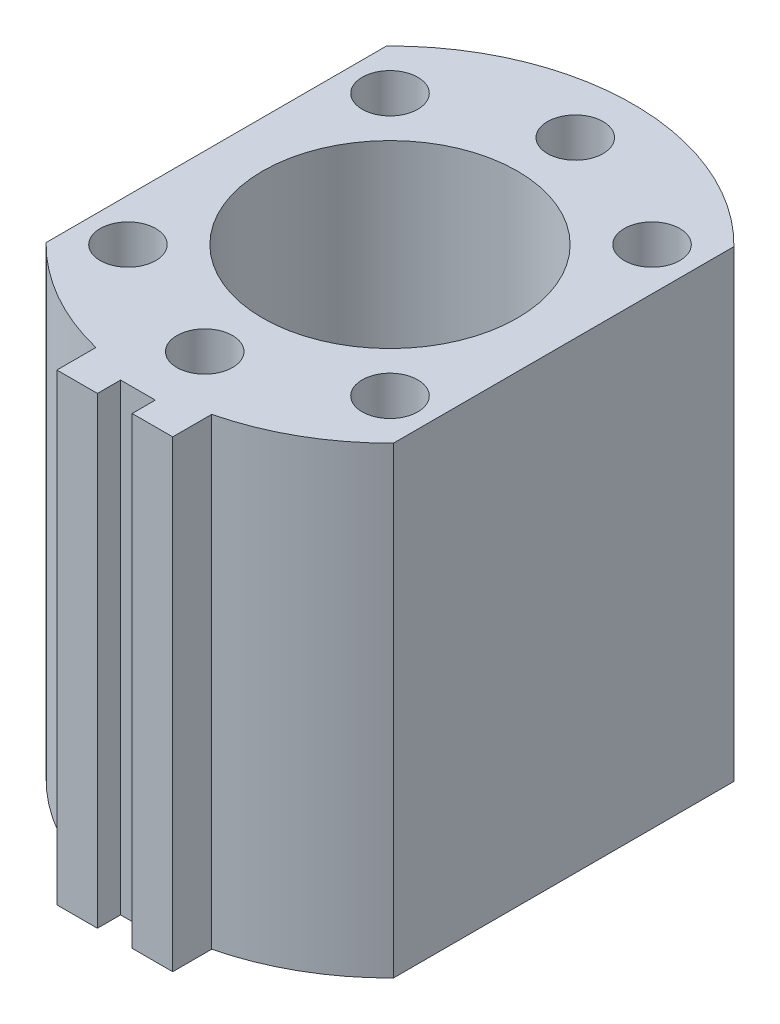
ISO-10303-21;
HEADER;
FILE_DESCRIPTION(('STEP AP214'),'2;1');
FILE_NAME('part.step','',(''),(''),'','','');
FILE_SCHEMA(('AUTOMOTIVE_DESIGN { 1 0 10303 214 1 1 1 1 }'));
ENDSEC;
DATA;
#1=APPLICATION_CONTEXT('core data for automotive mechanical design processes');
#2=APPLICATION_PROTOCOL_DEFINITION('international standard','automotive_design',2000,#1);
#3=PRODUCT_CONTEXT('',#1,'mechanical');
#4=PRODUCT('Part','Part','',(#3));
#5=PRODUCT_RELATED_PRODUCT_CATEGORY('part','',(#4));
#6=PRODUCT_DEFINITION_FORMATION('','',#4);
#7=PRODUCT_DEFINITION_CONTEXT('part definition',#1,'design');
#8=PRODUCT_DEFINITION('design','',#6,#7);
#9=PRODUCT_DEFINITION_SHAPE('','',#8);
#10=(LENGTH_UNIT() NAMED_UNIT(*) SI_UNIT(.MILLI.,.METRE.));
#11=(NAMED_UNIT(*) PLANE_ANGLE_UNIT() SI_UNIT($,.RADIAN.));
#12=(NAMED_UNIT(*) SI_UNIT($,.STERADIAN.) SOLID_ANGLE_UNIT());
#13=UNCERTAINTY_MEASURE_WITH_UNIT(LENGTH_MEASURE(1.E-05),#10,'distance_accuracy_value','');
#14=(GEOMETRIC_REPRESENTATION_CONTEXT(3) GLOBAL_UNCERTAINTY_ASSIGNED_CONTEXT((#13)) GLOBAL_UNIT_ASSIGNED_CONTEXT((#10,
#11,#12)) REPRESENTATION_CONTEXT('',''));
#15=CARTESIAN_POINT('',(0.,0.,0.));
#16=DIRECTION('',(0.,0.,1.));
#17=DIRECTION('',(1.,0.,0.));
#18=AXIS2_PLACEMENT_3D('',#15,#16,#17);
#19=CARTESIAN_POINT('',(0.,40.,0.));
#20=DIRECTION('',(0.,1.,0.));
#21=DIRECTION('',(0.,0.,1.));
#22=AXIS2_PLACEMENT_3D('',#19,#20,#21);
#23=PLANE('',#22);
#24=CARTESIAN_POINT('',(-2.79290479632266E-13,40.,-16.));
#25=DIRECTION('',(0.,1.,0.));
#26=DIRECTION('',(-0.707106781186539,0.,0.707106781186556));
#27=AXIS2_PLACEMENT_3D('',#24,#25,#26);
#28=CIRCLE('',#27,2.4);
#29=CARTESIAN_POINT('',(-1.69705627484797,40.,-14.3029437251523));
#30=VERTEX_POINT('',#29);
#31=EDGE_CURVE('E174',#30,#30,#28,.T.);
#32=ORIENTED_EDGE('',*,*,#31,.F.);
#33=EDGE_LOOP('',(#32));
#34=FACE_BOUND('',#33,.T.);
#35=CARTESIAN_POINT('',(11.3137084989846,40.,-11.3137084989849));
#36=DIRECTION('',(0.,1.,0.));
#37=DIRECTION('',(-1.,0.,0.));
#38=AXIS2_PLACEMENT_3D('',#35,#36,#37);
#39=CIRCLE('',#38,2.4);
#40=CARTESIAN_POINT('',(8.91370849898458,40.,-11.3137084989849));
#41=VERTEX_POINT('',#40);
#42=EDGE_CURVE('E178',#41,#41,#39,.T.);
#43=ORIENTED_EDGE('',*,*,#42,.F.);
#44=EDGE_LOOP('',(#43));
#45=FACE_BOUND('',#44,.T.);
#46=CARTESIAN_POINT('',(11.3137084989848,40.,11.3137084989847));
#47=DIRECTION('',(0.,1.,0.));
#48=DIRECTION('',(0.,0.,-1.));
#49=AXIS2_PLACEMENT_3D('',#46,#47,#48);
#50=CIRCLE('',#49,2.4);
#51=CARTESIAN_POINT('',(11.3137084989848,40.,8.9137084989847));
#52=VERTEX_POINT('',#51);
#53=EDGE_CURVE('E184',#52,#52,#50,.T.);
#54=ORIENTED_EDGE('',*,*,#53,.F.);
#55=EDGE_LOOP('',(#54));
#56=FACE_BOUND('',#55,.T.);
#57=CARTESIAN_POINT('',(1.6826817716975E-13,40.,16.));
#58=DIRECTION('',(0.,1.,0.));
#59=DIRECTION('',(0.707106781186544,0.,-0.707106781186551));
#60=AXIS2_PLACEMENT_3D('',#57,#58,#59);
#61=CIRCLE('',#60,2.4);
#62=CARTESIAN_POINT('',(1.69705627484787,40.,14.3029437251523));
#63=VERTEX_POINT('',#62);
#64=EDGE_CURVE('E190',#63,#63,#61,.T.);
#65=ORIENTED_EDGE('',*,*,#64,.F.);
#66=EDGE_LOOP('',(#65));
#67=FACE_BOUND('',#66,.T.);
#68=CARTESIAN_POINT('',(-11.3137084989847,40.,11.3137084989849));
#69=DIRECTION('',(0.,1.,0.));
#70=DIRECTION('',(1.,0.,0.));
#71=AXIS2_PLACEMENT_3D('',#68,#69,#70);
#72=CIRCLE('',#71,2.4);
#73=CARTESIAN_POINT('',(-8.91370849898466,40.,11.3137084989848));
#74=VERTEX_POINT('',#73);
#75=EDGE_CURVE('E196',#74,#74,#72,.T.);
#76=ORIENTED_EDGE('',*,*,#75,.F.);
#77=EDGE_LOOP('',(#76));
#78=FACE_BOUND('',#77,.T.);
#79=CARTESIAN_POINT('',(-11.3137084989848,40.,-11.3137084989847));
#80=DIRECTION('',(0.,1.,0.));
#81=DIRECTION('',(0.,0.,1.));
#82=AXIS2_PLACEMENT_3D('',#79,#80,#81);
#83=CIRCLE('',#82,2.4);
#84=CARTESIAN_POINT('',(-11.3137084989848,40.,-8.9137084989847));
#85=VERTEX_POINT('',#84);
#86=EDGE_CURVE('E202',#85,#85,#83,.T.);
#87=ORIENTED_EDGE('',*,*,#86,.F.);
#88=EDGE_LOOP('',(#87));
#89=FACE_BOUND('',#88,.T.);
#90=CARTESIAN_POINT('',(0.,40.,0.));
#91=DIRECTION('',(0.,1.,0.));
#92=DIRECTION('',(0.,0.,1.));
#93=AXIS2_PLACEMENT_3D('',#90,#91,#92);
#94=CIRCLE('',#93,11.);
#95=CARTESIAN_POINT('',(0.,40.,11.));
#96=VERTEX_POINT('',#95);
#97=EDGE_CURVE('E208',#96,#96,#94,.T.);
#98=ORIENTED_EDGE('',*,*,#97,.F.);
#99=EDGE_LOOP('',(#98));
#100=FACE_BOUND('',#99,.T.);
#101=DIRECTION('',(1.,0.,0.));
#102=VECTOR('',#101,1.);
#103=CARTESIAN_POINT('',(-5.,40.,23.7640262673697));
#104=LINE('',#103,#102);
#105=CARTESIAN_POINT('',(-5.,40.,23.7640262673697));
#106=VERTEX_POINT('',#105);
#107=CARTESIAN_POINT('',(-1.5,40.,23.7640262673697));
#108=VERTEX_POINT('',#107);
#109=EDGE_CURVE('E141',#106,#108,#104,.T.);
#110=ORIENTED_EDGE('',*,*,#109,.T.);
#111=DIRECTION('',(0.,0.,1.));
#112=VECTOR('',#111,1.);
#113=CARTESIAN_POINT('',(-1.5,40.,21.7640262673697));
#114=LINE('',#113,#112);
#115=CARTESIAN_POINT('',(-1.5,40.,21.7640262673697));
#116=VERTEX_POINT('',#115);
#117=EDGE_CURVE('E124',#116,#108,#114,.T.);
#118=ORIENTED_EDGE('',*,*,#117,.F.);
#119=DIRECTION('',(-1.,0.,0.));
#120=VECTOR('',#119,1.);
#121=CARTESIAN_POINT('',(-1.5,40.,21.7640262673697));
#122=LINE('',#121,#120);
#123=CARTESIAN_POINT('',(1.5,40.,21.7640262673697));
#124=VERTEX_POINT('',#123);
#125=EDGE_CURVE('E280',#124,#116,#122,.T.);
#126=ORIENTED_EDGE('',*,*,#125,.F.);
#127=DIRECTION('',(0.,0.,-1.));
#128=VECTOR('',#127,1.);
#129=CARTESIAN_POINT('',(1.5,40.,21.7640262673697));
#130=LINE('',#129,#128);
#131=CARTESIAN_POINT('',(1.5,40.,23.7640262673697));
#132=VERTEX_POINT('',#131);
#133=EDGE_CURVE('E134',#132,#124,#130,.T.);
#134=ORIENTED_EDGE('',*,*,#133,.F.);
#135=CARTESIAN_POINT('',(5.,40.,23.7640262673697));
#136=VERTEX_POINT('',#135);
#137=EDGE_CURVE('E152',#132,#136,#104,.T.);
#138=ORIENTED_EDGE('',*,*,#137,.T.);
#139=DIRECTION('',(0.,0.,-1.));
#140=VECTOR('',#139,1.);
#141=CARTESIAN_POINT('',(5.,40.,20.3960780543711));
#142=LINE('',#141,#140);
#143=CARTESIAN_POINT('',(5.,40.,20.3960780543711));
#144=VERTEX_POINT('',#143);
#145=EDGE_CURVE('E151',#136,#144,#142,.T.);
#146=ORIENTED_EDGE('',*,*,#145,.T.);
#147=CARTESIAN_POINT('',(0.,40.,0.));
#148=DIRECTION('',(0.,1.,0.));
#149=DIRECTION('',(0.,0.,1.));
#150=AXIS2_PLACEMENT_3D('',#147,#148,#149);
#151=CIRCLE('',#150,21.);
#152=CARTESIAN_POINT('',(15.,40.,14.6969384566991));
#153=VERTEX_POINT('',#152);
#154=EDGE_CURVE('E57',#144,#153,#151,.T.);
#155=ORIENTED_EDGE('',*,*,#154,.T.);
#156=DIRECTION('',(0.,0.,-1.));
#157=VECTOR('',#156,1.);
#158=CARTESIAN_POINT('',(15.,40.,-14.6969384566991));
#159=LINE('',#158,#157);
#160=CARTESIAN_POINT('',(15.,40.,-14.6969384566991));
#161=VERTEX_POINT('',#160);
#162=EDGE_CURVE('E225',#153,#161,#159,.T.);
#163=ORIENTED_EDGE('',*,*,#162,.T.);
#164=CARTESIAN_POINT('',(0.,40.,0.));
#165=DIRECTION('',(0.,1.,0.));
#166=DIRECTION('',(0.,0.,1.));
#167=AXIS2_PLACEMENT_3D('',#164,#165,#166);
#168=CIRCLE('',#167,21.);
#169=CARTESIAN_POINT('',(-15.,40.,-14.6969384566991));
#170=VERTEX_POINT('',#169);
#171=EDGE_CURVE('E217',#161,#170,#168,.T.);
#172=ORIENTED_EDGE('',*,*,#171,.T.);
#173=DIRECTION('',(0.,0.,1.));
#174=VECTOR('',#173,1.);
#175=CARTESIAN_POINT('',(-15.,40.,-14.6969384566991));
#176=LINE('',#175,#174);
#177=CARTESIAN_POINT('',(-15.,40.,14.6969384566991));
#178=VERTEX_POINT('',#177);
#179=EDGE_CURVE('E220',#170,#178,#176,.T.);
#180=ORIENTED_EDGE('',*,*,#179,.T.);
#181=CARTESIAN_POINT('',(-5.,40.,20.3960780543711));
#182=VERTEX_POINT('',#181);
#183=EDGE_CURVE('E223',#178,#182,#151,.T.);
#184=ORIENTED_EDGE('',*,*,#183,.T.);
#185=DIRECTION('',(0.,0.,1.));
#186=VECTOR('',#185,1.);
#187=CARTESIAN_POINT('',(-5.,40.,20.3960780543711));
#188=LINE('',#187,#186);
#189=EDGE_CURVE('E149',#182,#106,#188,.T.);
#190=ORIENTED_EDGE('',*,*,#189,.T.);
#191=EDGE_LOOP('',(#110,#118,#126,#134,#138,#146,#155,#163,#172,#180,#184,#190));
#192=FACE_BOUND('',#191,.T.);
#193=ADVANCED_FACE('F34',(#34,#45,#56,#67,#78,#89,#100,#192),#23,.T.);
#194=CARTESIAN_POINT('',(0.,0.,0.));
#195=DIRECTION('',(0.,1.,0.));
#196=DIRECTION('',(0.,0.,1.));
#197=AXIS2_PLACEMENT_3D('',#194,#195,#196);
#198=PLANE('',#197);
#199=CARTESIAN_POINT('',(0.,0.,0.));
#200=DIRECTION('',(0.,1.,0.));
#201=DIRECTION('',(0.,0.,1.));
#202=AXIS2_PLACEMENT_3D('',#199,#200,#201);
#203=CIRCLE('',#202,11.);
#204=CARTESIAN_POINT('',(0.,0.,11.));
#205=VERTEX_POINT('',#204);
#206=EDGE_CURVE('E211',#205,#205,#203,.T.);
#207=ORIENTED_EDGE('',*,*,#206,.T.);
#208=EDGE_LOOP('',(#207));
#209=FACE_BOUND('',#208,.T.);
#210=DIRECTION('',(0.,0.,1.));
#211=VECTOR('',#210,1.);
#212=CARTESIAN_POINT('',(-1.5,0.,21.7640262673697));
#213=LINE('',#212,#211);
#214=CARTESIAN_POINT('',(-1.5,0.,21.7640262673697));
#215=VERTEX_POINT('',#214);
#216=CARTESIAN_POINT('',(-1.5,0.,23.7640262673697));
#217=VERTEX_POINT('',#216);
#218=EDGE_CURVE('E283',#215,#217,#213,.T.);
#219=ORIENTED_EDGE('',*,*,#218,.T.);
#220=DIRECTION('',(1.,0.,0.));
#221=VECTOR('',#220,1.);
#222=CARTESIAN_POINT('',(-5.,0.,23.7640262673697));
#223=LINE('',#222,#221);
#224=CARTESIAN_POINT('',(-5.,0.,23.7640262673697));
#225=VERTEX_POINT('',#224);
#226=EDGE_CURVE('E143',#225,#217,#223,.T.);
#227=ORIENTED_EDGE('',*,*,#226,.F.);
#228=DIRECTION('',(0.,0.,1.));
#229=VECTOR('',#228,1.);
#230=CARTESIAN_POINT('',(-5.,0.,20.3960780543711));
#231=LINE('',#230,#229);
#232=CARTESIAN_POINT('',(-5.,0.,20.3960780543711));
#233=VERTEX_POINT('',#232);
#234=EDGE_CURVE('E144',#233,#225,#231,.T.);
#235=ORIENTED_EDGE('',*,*,#234,.F.);
#236=CARTESIAN_POINT('',(0.,0.,0.));
#237=DIRECTION('',(0.,1.,0.));
#238=DIRECTION('',(0.,0.,1.));
#239=AXIS2_PLACEMENT_3D('',#236,#237,#238);
#240=CIRCLE('',#239,21.);
#241=CARTESIAN_POINT('',(-15.,0.,14.6969384566991));
#242=VERTEX_POINT('',#241);
#243=EDGE_CURVE('E233',#242,#233,#240,.T.);
#244=ORIENTED_EDGE('',*,*,#243,.F.);
#245=DIRECTION('',(0.,0.,1.));
#246=VECTOR('',#245,1.);
#247=CARTESIAN_POINT('',(-15.,0.,-14.6969384566991));
#248=LINE('',#247,#246);
#249=CARTESIAN_POINT('',(-15.,0.,-14.6969384566991));
#250=VERTEX_POINT('',#249);
#251=EDGE_CURVE('E230',#250,#242,#248,.T.);
#252=ORIENTED_EDGE('',*,*,#251,.F.);
#253=CARTESIAN_POINT('',(0.,0.,0.));
#254=DIRECTION('',(0.,1.,0.));
#255=DIRECTION('',(0.,0.,1.));
#256=AXIS2_PLACEMENT_3D('',#253,#254,#255);
#257=CIRCLE('',#256,21.);
#258=CARTESIAN_POINT('',(15.,0.,-14.6969384566991));
#259=VERTEX_POINT('',#258);
#260=EDGE_CURVE('E214',#259,#250,#257,.T.);
#261=ORIENTED_EDGE('',*,*,#260,.F.);
#262=DIRECTION('',(0.,0.,-1.));
#263=VECTOR('',#262,1.);
#264=CARTESIAN_POINT('',(15.,0.,-14.6969384566991));
#265=LINE('',#264,#263);
#266=CARTESIAN_POINT('',(15.,0.,14.6969384566991));
#267=VERTEX_POINT('',#266);
#268=EDGE_CURVE('E221',#267,#259,#265,.T.);
#269=ORIENTED_EDGE('',*,*,#268,.F.);
#270=CARTESIAN_POINT('',(5.,0.,20.3960780543711));
#271=VERTEX_POINT('',#270);
#272=EDGE_CURVE('E232',#271,#267,#240,.T.);
#273=ORIENTED_EDGE('',*,*,#272,.F.);
#274=DIRECTION('',(0.,0.,-1.));
#275=VECTOR('',#274,1.);
#276=CARTESIAN_POINT('',(5.,0.,20.3960780543711));
#277=LINE('',#276,#275);
#278=CARTESIAN_POINT('',(5.,0.,23.7640262673697));
#279=VERTEX_POINT('',#278);
#280=EDGE_CURVE('E162',#279,#271,#277,.T.);
#281=ORIENTED_EDGE('',*,*,#280,.F.);
#282=CARTESIAN_POINT('',(1.5,0.,23.7640262673697));
#283=VERTEX_POINT('',#282);
#284=EDGE_CURVE('E160',#283,#279,#223,.T.);
#285=ORIENTED_EDGE('',*,*,#284,.F.);
#286=DIRECTION('',(0.,0.,-1.));
#287=VECTOR('',#286,1.);
#288=CARTESIAN_POINT('',(1.5,0.,21.7640262673697));
#289=LINE('',#288,#287);
#290=CARTESIAN_POINT('',(1.5,0.,21.7640262673697));
#291=VERTEX_POINT('',#290);
#292=EDGE_CURVE('E49',#283,#291,#289,.T.);
#293=ORIENTED_EDGE('',*,*,#292,.T.);
#294=DIRECTION('',(-1.,0.,0.));
#295=VECTOR('',#294,1.);
#296=CARTESIAN_POINT('',(-1.5,0.,21.7640262673697));
#297=LINE('',#296,#295);
#298=EDGE_CURVE('E135',#291,#215,#297,.T.);
#299=ORIENTED_EDGE('',*,*,#298,.T.);
#300=EDGE_LOOP('',(#219,#227,#235,#244,#252,#261,#269,#273,#281,#285,#293,#299));
#301=FACE_BOUND('',#300,.T.);
#302=ADVANCED_FACE('F249',(#209,#301),#198,.F.);
#303=CARTESIAN_POINT('',(-5.,40.,23.7640262673697));
#304=DIRECTION('',(0.,0.,-1.));
#305=DIRECTION('',(-1.,0.,0.));
#306=AXIS2_PLACEMENT_3D('',#303,#304,#305);
#307=PLANE('',#306);
#308=DIRECTION('',(0.,-1.,0.));
#309=VECTOR('',#308,1.);
#310=CARTESIAN_POINT('',(-1.5,40.,23.7640262673697));
#311=LINE('',#310,#309);
#312=EDGE_CURVE('E128',#108,#217,#311,.T.);
#313=ORIENTED_EDGE('',*,*,#312,.F.);
#314=ORIENTED_EDGE('',*,*,#109,.F.);
#315=DIRECTION('',(0.,-1.,0.));
#316=VECTOR('',#315,1.);
#317=CARTESIAN_POINT('',(-5.,40.,23.7640262673697));
#318=LINE('',#317,#316);
#319=EDGE_CURVE('E172',#106,#225,#318,.T.);
#320=ORIENTED_EDGE('',*,*,#319,.T.);
#321=ORIENTED_EDGE('',*,*,#226,.T.);
#322=EDGE_LOOP('',(#313,#314,#320,#321));
#323=FACE_BOUND('',#322,.T.);
#324=ADVANCED_FACE('F139',(#323),#307,.F.);
#325=DIRECTION('',(0.,-1.,0.));
#326=VECTOR('',#325,1.);
#327=CARTESIAN_POINT('',(1.5,40.,23.7640262673697));
#328=LINE('',#327,#326);
#329=EDGE_CURVE('E145',#132,#283,#328,.T.);
#330=ORIENTED_EDGE('',*,*,#329,.T.);
#331=ORIENTED_EDGE('',*,*,#284,.T.);
#332=DIRECTION('',(0.,-1.,0.));
#333=VECTOR('',#332,1.);
#334=CARTESIAN_POINT('',(5.,40.,23.7640262673697));
#335=LINE('',#334,#333);
#336=EDGE_CURVE('E169',#136,#279,#335,.T.);
#337=ORIENTED_EDGE('',*,*,#336,.F.);
#338=ORIENTED_EDGE('',*,*,#137,.F.);
#339=EDGE_LOOP('',(#330,#331,#337,#338));
#340=FACE_BOUND('',#339,.T.);
#341=ADVANCED_FACE('F272',(#340),#307,.F.);
#342=CARTESIAN_POINT('',(0.,40.,0.));
#343=DIRECTION('',(0.,-1.,0.));
#344=DIRECTION('',(0.,0.,-1.));
#345=AXIS2_PLACEMENT_3D('',#342,#343,#344);
#346=CYLINDRICAL_SURFACE('',#345,21.);
#347=DIRECTION('',(0.,-1.,0.));
#348=VECTOR('',#347,1.);
#349=CARTESIAN_POINT('',(-5.,40.,20.3960780543711));
#350=LINE('',#349,#348);
#351=EDGE_CURVE('E154',#182,#233,#350,.T.);
#352=ORIENTED_EDGE('',*,*,#351,.F.);
#353=ORIENTED_EDGE('',*,*,#183,.F.);
#354=DIRECTION('',(0.,-1.,0.));
#355=VECTOR('',#354,1.);
#356=CARTESIAN_POINT('',(-15.,40.,14.6969384566991));
#357=LINE('',#356,#355);
#358=EDGE_CURVE('E42',#178,#242,#357,.T.);
#359=ORIENTED_EDGE('',*,*,#358,.T.);
#360=ORIENTED_EDGE('',*,*,#243,.T.);
#361=EDGE_LOOP('',(#352,#353,#359,#360));
#362=FACE_BOUND('',#361,.T.);
#363=ADVANCED_FACE('F245',(#362),#346,.T.);
#364=DIRECTION('',(0.,-1.,0.));
#365=VECTOR('',#364,1.);
#366=CARTESIAN_POINT('',(5.,40.,20.3960780543711));
#367=LINE('',#366,#365);
#368=EDGE_CURVE('E167',#144,#271,#367,.T.);
#369=ORIENTED_EDGE('',*,*,#368,.T.);
#370=ORIENTED_EDGE('',*,*,#272,.T.);
#371=DIRECTION('',(0.,-1.,0.));
#372=VECTOR('',#371,1.);
#373=CARTESIAN_POINT('',(15.,40.,14.6969384566991));
#374=LINE('',#373,#372);
#375=EDGE_CURVE('E238',#153,#267,#374,.T.);
#376=ORIENTED_EDGE('',*,*,#375,.F.);
#377=ORIENTED_EDGE('',*,*,#154,.F.);
#378=EDGE_LOOP('',(#369,#370,#376,#377));
#379=FACE_BOUND('',#378,.T.);
#380=ADVANCED_FACE('F263',(#379),#346,.T.);
#381=CARTESIAN_POINT('',(0.,40.,0.));
#382=DIRECTION('',(0.,-1.,0.));
#383=DIRECTION('',(0.,0.,-1.));
#384=AXIS2_PLACEMENT_3D('',#381,#382,#383);
#385=CYLINDRICAL_SURFACE('',#384,21.);
#386=ORIENTED_EDGE('',*,*,#260,.T.);
#387=DIRECTION('',(0.,-1.,0.));
#388=VECTOR('',#387,1.);
#389=CARTESIAN_POINT('',(-15.,40.,-14.6969384566991));
#390=LINE('',#389,#388);
#391=EDGE_CURVE('E11',#170,#250,#390,.T.);
#392=ORIENTED_EDGE('',*,*,#391,.F.);
#393=ORIENTED_EDGE('',*,*,#171,.F.);
#394=DIRECTION('',(0.,-1.,0.));
#395=VECTOR('',#394,1.);
#396=CARTESIAN_POINT('',(15.,40.,-14.6969384566991));
#397=LINE('',#396,#395);
#398=EDGE_CURVE('E227',#161,#259,#397,.T.);
#399=ORIENTED_EDGE('',*,*,#398,.T.);
#400=EDGE_LOOP('',(#386,#392,#393,#399));
#401=FACE_BOUND('',#400,.T.);
#402=ADVANCED_FACE('F36',(#401),#385,.T.);
#403=CARTESIAN_POINT('',(-15.,40.,-14.6969384566991));
#404=DIRECTION('',(1.,0.,0.));
#405=DIRECTION('',(0.,0.,-1.));
#406=AXIS2_PLACEMENT_3D('',#403,#404,#405);
#407=PLANE('',#406);
#408=ORIENTED_EDGE('',*,*,#251,.T.);
#409=ORIENTED_EDGE('',*,*,#358,.F.);
#410=ORIENTED_EDGE('',*,*,#179,.F.);
#411=ORIENTED_EDGE('',*,*,#391,.T.);
#412=EDGE_LOOP('',(#408,#409,#410,#411));
#413=FACE_BOUND('',#412,.T.);
#414=ADVANCED_FACE('F255',(#413),#407,.F.);
#415=CARTESIAN_POINT('',(15.,40.,-14.6969384566991));
#416=DIRECTION('',(-1.,0.,0.));
#417=DIRECTION('',(0.,0.,1.));
#418=AXIS2_PLACEMENT_3D('',#415,#416,#417);
#419=PLANE('',#418);
#420=ORIENTED_EDGE('',*,*,#268,.T.);
#421=ORIENTED_EDGE('',*,*,#398,.F.);
#422=ORIENTED_EDGE('',*,*,#162,.F.);
#423=ORIENTED_EDGE('',*,*,#375,.T.);
#424=EDGE_LOOP('',(#420,#421,#422,#423));
#425=FACE_BOUND('',#424,.T.);
#426=ADVANCED_FACE('F261',(#425),#419,.F.);
#427=CARTESIAN_POINT('',(0.,0.,0.));
#428=DIRECTION('',(0.,1.,0.));
#429=DIRECTION('',(0.,0.,1.));
#430=AXIS2_PLACEMENT_3D('',#427,#428,#429);
#431=CYLINDRICAL_SURFACE('',#430,11.);
#432=ORIENTED_EDGE('',*,*,#206,.F.);
#433=EDGE_LOOP('',(#432));
#434=FACE_BOUND('',#433,.T.);
#435=ORIENTED_EDGE('',*,*,#97,.T.);
#436=EDGE_LOOP('',(#435));
#437=FACE_BOUND('',#436,.T.);
#438=ADVANCED_FACE('F308',(#434,#437),#431,.F.);
#439=CARTESIAN_POINT('',(-11.3137084989848,32.,-11.3137084989847));
#440=DIRECTION('',(0.,1.,0.));
#441=DIRECTION('',(0.,0.,1.));
#442=AXIS2_PLACEMENT_3D('',#439,#440,#441);
#443=CYLINDRICAL_SURFACE('',#442,2.4);
#444=CARTESIAN_POINT('',(-11.3137084989848,32.,-11.3137084989847));
#445=DIRECTION('',(0.,1.,0.));
#446=DIRECTION('',(0.,0.,1.));
#447=AXIS2_PLACEMENT_3D('',#444,#445,#446);
#448=CIRCLE('',#447,2.4);
#449=CARTESIAN_POINT('',(-11.3137084989848,32.,-8.9137084989847));
#450=VERTEX_POINT('',#449);
#451=EDGE_CURVE('E205',#450,#450,#448,.T.);
#452=ORIENTED_EDGE('',*,*,#451,.F.);
#453=EDGE_LOOP('',(#452));
#454=FACE_BOUND('',#453,.T.);
#455=ORIENTED_EDGE('',*,*,#86,.T.);
#456=EDGE_LOOP('',(#455));
#457=FACE_BOUND('',#456,.T.);
#458=ADVANCED_FACE('F456',(#454,#457),#443,.F.);
#459=CARTESIAN_POINT('',(-11.3137084989848,32.,-11.3137084989847));
#460=DIRECTION('',(0.,1.,0.));
#461=DIRECTION('',(0.,0.,1.));
#462=AXIS2_PLACEMENT_3D('',#459,#460,#461);
#463=PLANE('',#462);
#464=ORIENTED_EDGE('',*,*,#451,.T.);
#465=EDGE_LOOP('',(#464));
#466=FACE_BOUND('',#465,.T.);
#467=ADVANCED_FACE('F448',(#466),#463,.T.);
#468=CARTESIAN_POINT('',(-11.3137084989847,32.,11.3137084989849));
#469=DIRECTION('',(0.,1.,0.));
#470=DIRECTION('',(0.,0.,1.));
#471=AXIS2_PLACEMENT_3D('',#468,#469,#470);
#472=CYLINDRICAL_SURFACE('',#471,2.4);
#473=CARTESIAN_POINT('',(-11.3137084989847,32.,11.3137084989849));
#474=DIRECTION('',(0.,1.,0.));
#475=DIRECTION('',(1.,0.,0.));
#476=AXIS2_PLACEMENT_3D('',#473,#474,#475);
#477=CIRCLE('',#476,2.4);
#478=CARTESIAN_POINT('',(-8.91370849898466,32.,11.3137084989848));
#479=VERTEX_POINT('',#478);
#480=EDGE_CURVE('E199',#479,#479,#477,.T.);
#481=ORIENTED_EDGE('',*,*,#480,.F.);
#482=EDGE_LOOP('',(#481));
#483=FACE_BOUND('',#482,.T.);
#484=ORIENTED_EDGE('',*,*,#75,.T.);
#485=EDGE_LOOP('',(#484));
#486=FACE_BOUND('',#485,.T.);
#487=ADVANCED_FACE('F440',(#483,#486),#472,.F.);
#488=CARTESIAN_POINT('',(-11.3137084989847,32.,11.3137084989849));
#489=DIRECTION('',(0.,1.,0.));
#490=DIRECTION('',(1.,0.,0.));
#491=AXIS2_PLACEMENT_3D('',#488,#489,#490);
#492=PLANE('',#491);
#493=ORIENTED_EDGE('',*,*,#480,.T.);
#494=EDGE_LOOP('',(#493));
#495=FACE_BOUND('',#494,.T.);
#496=ADVANCED_FACE('F432',(#495),#492,.T.);
#497=CARTESIAN_POINT('',(1.6826817716975E-13,32.,16.));
#498=DIRECTION('',(0.,1.,0.));
#499=DIRECTION('',(0.,0.,1.));
#500=AXIS2_PLACEMENT_3D('',#497,#498,#499);
#501=CYLINDRICAL_SURFACE('',#500,2.4);
#502=CARTESIAN_POINT('',(1.6826817716975E-13,32.,16.));
#503=DIRECTION('',(0.,1.,0.));
#504=DIRECTION('',(0.707106781186544,0.,-0.707106781186551));
#505=AXIS2_PLACEMENT_3D('',#502,#503,#504);
#506=CIRCLE('',#505,2.4);
#507=CARTESIAN_POINT('',(1.69705627484787,32.,14.3029437251523));
#508=VERTEX_POINT('',#507);
#509=EDGE_CURVE('E193',#508,#508,#506,.T.);
#510=ORIENTED_EDGE('',*,*,#509,.F.);
#511=EDGE_LOOP('',(#510));
#512=FACE_BOUND('',#511,.T.);
#513=ORIENTED_EDGE('',*,*,#64,.T.);
#514=EDGE_LOOP('',(#513));
#515=FACE_BOUND('',#514,.T.);
#516=ADVANCED_FACE('F424',(#512,#515),#501,.F.);
#517=CARTESIAN_POINT('',(1.6826817716975E-13,32.,16.));
#518=DIRECTION('',(0.,1.,0.));
#519=DIRECTION('',(0.707106781186544,0.,-0.707106781186551));
#520=AXIS2_PLACEMENT_3D('',#517,#518,#519);
#521=PLANE('',#520);
#522=ORIENTED_EDGE('',*,*,#509,.T.);
#523=EDGE_LOOP('',(#522));
#524=FACE_BOUND('',#523,.T.);
#525=ADVANCED_FACE('F416',(#524),#521,.T.);
#526=CARTESIAN_POINT('',(11.3137084989848,32.,11.3137084989847));
#527=DIRECTION('',(0.,1.,0.));
#528=DIRECTION('',(0.,0.,1.));
#529=AXIS2_PLACEMENT_3D('',#526,#527,#528);
#530=CYLINDRICAL_SURFACE('',#529,2.4);
#531=CARTESIAN_POINT('',(11.3137084989848,32.,11.3137084989847));
#532=DIRECTION('',(0.,1.,0.));
#533=DIRECTION('',(0.,0.,-1.));
#534=AXIS2_PLACEMENT_3D('',#531,#532,#533);
#535=CIRCLE('',#534,2.4);
#536=CARTESIAN_POINT('',(11.3137084989848,32.,8.9137084989847));
#537=VERTEX_POINT('',#536);
#538=EDGE_CURVE('E187',#537,#537,#535,.T.);
#539=ORIENTED_EDGE('',*,*,#538,.F.);
#540=EDGE_LOOP('',(#539));
#541=FACE_BOUND('',#540,.T.);
#542=ORIENTED_EDGE('',*,*,#53,.T.);
#543=EDGE_LOOP('',(#542));
#544=FACE_BOUND('',#543,.T.);
#545=ADVANCED_FACE('F408',(#541,#544),#530,.F.);
#546=CARTESIAN_POINT('',(11.3137084989848,32.,11.3137084989847));
#547=DIRECTION('',(0.,1.,0.));
#548=DIRECTION('',(0.,0.,-1.));
#549=AXIS2_PLACEMENT_3D('',#546,#547,#548);
#550=PLANE('',#549);
#551=ORIENTED_EDGE('',*,*,#538,.T.);
#552=EDGE_LOOP('',(#551));
#553=FACE_BOUND('',#552,.T.);
#554=ADVANCED_FACE('F400',(#553),#550,.T.);
#555=CARTESIAN_POINT('',(11.3137084989846,32.,-11.3137084989849));
#556=DIRECTION('',(0.,1.,0.));
#557=DIRECTION('',(0.,0.,1.));
#558=AXIS2_PLACEMENT_3D('',#555,#556,#557);
#559=CYLINDRICAL_SURFACE('',#558,2.4);
#560=CARTESIAN_POINT('',(11.3137084989846,32.,-11.3137084989849));
#561=DIRECTION('',(0.,1.,0.));
#562=DIRECTION('',(-1.,0.,0.));
#563=AXIS2_PLACEMENT_3D('',#560,#561,#562);
#564=CIRCLE('',#563,2.4);
#565=CARTESIAN_POINT('',(8.91370849898458,32.,-11.3137084989849));
#566=VERTEX_POINT('',#565);
#567=EDGE_CURVE('E181',#566,#566,#564,.T.);
#568=ORIENTED_EDGE('',*,*,#567,.F.);
#569=EDGE_LOOP('',(#568));
#570=FACE_BOUND('',#569,.T.);
#571=ORIENTED_EDGE('',*,*,#42,.T.);
#572=EDGE_LOOP('',(#571));
#573=FACE_BOUND('',#572,.T.);
#574=ADVANCED_FACE('F392',(#570,#573),#559,.F.);
#575=CARTESIAN_POINT('',(11.3137084989846,32.,-11.3137084989849));
#576=DIRECTION('',(0.,1.,0.));
#577=DIRECTION('',(-1.,0.,0.));
#578=AXIS2_PLACEMENT_3D('',#575,#576,#577);
#579=PLANE('',#578);
#580=ORIENTED_EDGE('',*,*,#567,.T.);
#581=EDGE_LOOP('',(#580));
#582=FACE_BOUND('',#581,.T.);
#583=ADVANCED_FACE('F384',(#582),#579,.T.);
#584=CARTESIAN_POINT('',(-2.79290479632266E-13,32.,-16.));
#585=DIRECTION('',(0.,1.,0.));
#586=DIRECTION('',(0.,0.,1.));
#587=AXIS2_PLACEMENT_3D('',#584,#585,#586);
#588=CYLINDRICAL_SURFACE('',#587,2.4);
#589=CARTESIAN_POINT('',(-2.79290479632266E-13,32.,-16.));
#590=DIRECTION('',(0.,1.,0.));
#591=DIRECTION('',(-0.707106781186539,0.,0.707106781186556));
#592=AXIS2_PLACEMENT_3D('',#589,#590,#591);
#593=CIRCLE('',#592,2.4);
#594=CARTESIAN_POINT('',(-1.69705627484797,32.,-14.3029437251523));
#595=VERTEX_POINT('',#594);
#596=EDGE_CURVE('E175',#595,#595,#593,.T.);
#597=ORIENTED_EDGE('',*,*,#596,.F.);
#598=EDGE_LOOP('',(#597));
#599=FACE_BOUND('',#598,.T.);
#600=ORIENTED_EDGE('',*,*,#31,.T.);
#601=EDGE_LOOP('',(#600));
#602=FACE_BOUND('',#601,.T.);
#603=ADVANCED_FACE('F376',(#599,#602),#588,.F.);
#604=CARTESIAN_POINT('',(-2.79290479632266E-13,32.,-16.));
#605=DIRECTION('',(0.,1.,0.));
#606=DIRECTION('',(-0.707106781186539,0.,0.707106781186556));
#607=AXIS2_PLACEMENT_3D('',#604,#605,#606);
#608=PLANE('',#607);
#609=ORIENTED_EDGE('',*,*,#596,.T.);
#610=EDGE_LOOP('',(#609));
#611=FACE_BOUND('',#610,.T.);
#612=ADVANCED_FACE('F368',(#611),#608,.T.);
#613=CARTESIAN_POINT('',(-5.,40.,20.3960780543711));
#614=DIRECTION('',(1.,0.,0.));
#615=DIRECTION('',(0.,0.,-1.));
#616=AXIS2_PLACEMENT_3D('',#613,#614,#615);
#617=PLANE('',#616);
#618=ORIENTED_EDGE('',*,*,#234,.T.);
#619=ORIENTED_EDGE('',*,*,#319,.F.);
#620=ORIENTED_EDGE('',*,*,#189,.F.);
#621=ORIENTED_EDGE('',*,*,#351,.T.);
#622=EDGE_LOOP('',(#618,#619,#620,#621));
#623=FACE_BOUND('',#622,.T.);
#624=ADVANCED_FACE('F252',(#623),#617,.F.);
#625=CARTESIAN_POINT('',(5.,40.,20.3960780543711));
#626=DIRECTION('',(-1.,0.,0.));
#627=DIRECTION('',(0.,0.,1.));
#628=AXIS2_PLACEMENT_3D('',#625,#626,#627);
#629=PLANE('',#628);
#630=ORIENTED_EDGE('',*,*,#280,.T.);
#631=ORIENTED_EDGE('',*,*,#368,.F.);
#632=ORIENTED_EDGE('',*,*,#145,.F.);
#633=ORIENTED_EDGE('',*,*,#336,.T.);
#634=EDGE_LOOP('',(#630,#631,#632,#633));
#635=FACE_BOUND('',#634,.T.);
#636=ADVANCED_FACE('F267',(#635),#629,.F.);
#637=CARTESIAN_POINT('',(-1.5,40.,21.7640262673697));
#638=DIRECTION('',(1.,0.,0.));
#639=DIRECTION('',(0.,0.,-1.));
#640=AXIS2_PLACEMENT_3D('',#637,#638,#639);
#641=PLANE('',#640);
#642=ORIENTED_EDGE('',*,*,#218,.F.);
#643=DIRECTION('',(0.,-1.,0.));
#644=VECTOR('',#643,1.);
#645=CARTESIAN_POINT('',(-1.5,40.,21.7640262673697));
#646=LINE('',#645,#644);
#647=EDGE_CURVE('E130',#116,#215,#646,.T.);
#648=ORIENTED_EDGE('',*,*,#647,.F.);
#649=ORIENTED_EDGE('',*,*,#117,.T.);
#650=ORIENTED_EDGE('',*,*,#312,.T.);
#651=EDGE_LOOP('',(#642,#648,#649,#650));
#652=FACE_BOUND('',#651,.T.);
#653=ADVANCED_FACE('F127',(#652),#641,.T.);
#654=CARTESIAN_POINT('',(1.5,40.,21.7640262673697));
#655=DIRECTION('',(-1.,0.,0.));
#656=DIRECTION('',(0.,0.,1.));
#657=AXIS2_PLACEMENT_3D('',#654,#655,#656);
#658=PLANE('',#657);
#659=ORIENTED_EDGE('',*,*,#292,.F.);
#660=ORIENTED_EDGE('',*,*,#329,.F.);
#661=ORIENTED_EDGE('',*,*,#133,.T.);
#662=DIRECTION('',(0.,-1.,0.));
#663=VECTOR('',#662,1.);
#664=CARTESIAN_POINT('',(1.5,40.,21.7640262673697));
#665=LINE('',#664,#663);
#666=EDGE_CURVE('E275',#124,#291,#665,.T.);
#667=ORIENTED_EDGE('',*,*,#666,.T.);
#668=EDGE_LOOP('',(#659,#660,#661,#667));
#669=FACE_BOUND('',#668,.T.);
#670=ADVANCED_FACE('F287',(#669),#658,.T.);
#671=CARTESIAN_POINT('',(-1.5,40.,21.7640262673697));
#672=DIRECTION('',(0.,0.,1.));
#673=DIRECTION('',(1.,0.,0.));
#674=AXIS2_PLACEMENT_3D('',#671,#672,#673);
#675=PLANE('',#674);
#676=ORIENTED_EDGE('',*,*,#298,.F.);
#677=ORIENTED_EDGE('',*,*,#666,.F.);
#678=ORIENTED_EDGE('',*,*,#125,.T.);
#679=ORIENTED_EDGE('',*,*,#647,.T.);
#680=EDGE_LOOP('',(#676,#677,#678,#679));
#681=FACE_BOUND('',#680,.T.);
#682=ADVANCED_FACE('F290',(#681),#675,.T.);
#683=CLOSED_SHELL('',(#193,#302,#324,#341,#363,#380,#402,#414,#426,#438,#458,#467,#487,#496,
#516,#525,#545,#554,#574,#583,#603,#612,#624,#636,#653,#670,#682));
#684=MANIFOLD_SOLID_BREP('B2',#683);
#685=ADVANCED_BREP_SHAPE_REPRESENTATION('',(#18,#684),#14);
#686=SHAPE_DEFINITION_REPRESENTATION(#9,#685);
ENDSEC;
END-ISO-10303-21;
